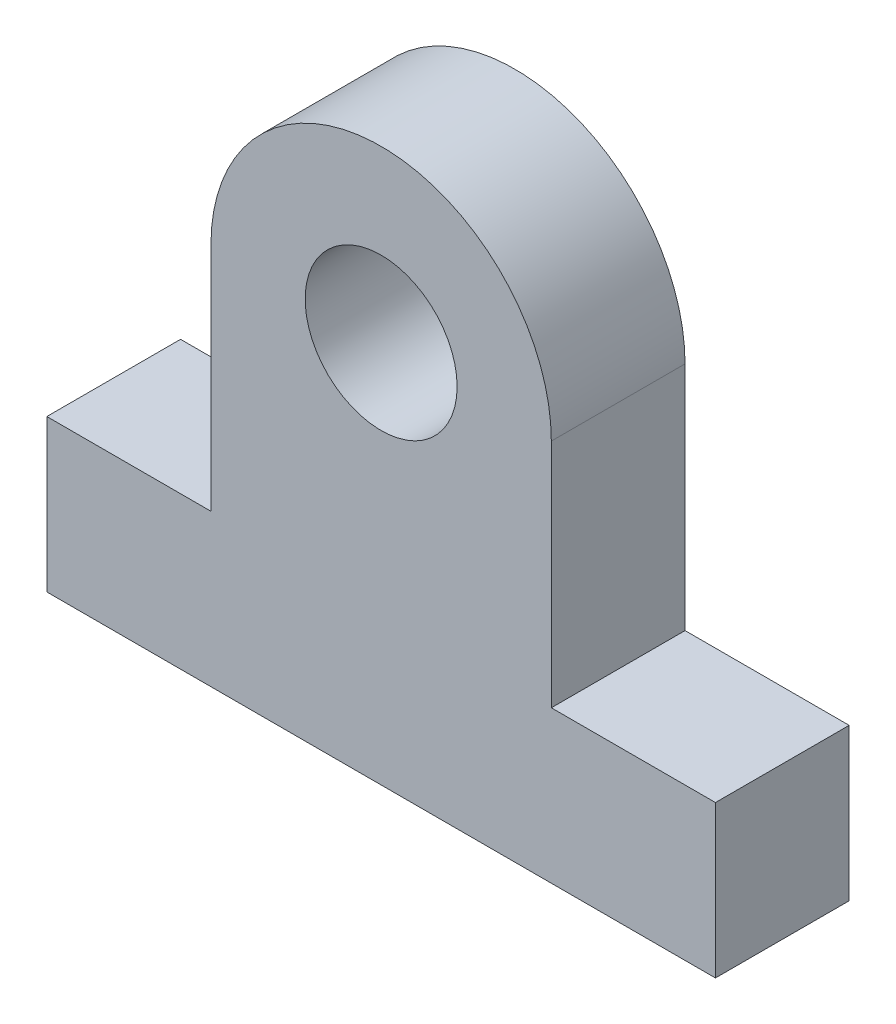
ISO-10303-21;
HEADER;
FILE_DESCRIPTION(('STEP AP214'),'2;1');
FILE_NAME('part.step','',(''),(''),'','','');
FILE_SCHEMA(('AUTOMOTIVE_DESIGN { 1 0 10303 214 1 1 1 1 }'));
ENDSEC;
DATA;
#1=APPLICATION_CONTEXT('core data for automotive mechanical design processes');
#2=APPLICATION_PROTOCOL_DEFINITION('international standard','automotive_design',2000,#1);
#3=PRODUCT_CONTEXT('',#1,'mechanical');
#4=PRODUCT('Part','Part','',(#3));
#5=PRODUCT_RELATED_PRODUCT_CATEGORY('part','',(#4));
#6=PRODUCT_DEFINITION_FORMATION('','',#4);
#7=PRODUCT_DEFINITION_CONTEXT('part definition',#1,'design');
#8=PRODUCT_DEFINITION('design','',#6,#7);
#9=PRODUCT_DEFINITION_SHAPE('','',#8);
#10=(LENGTH_UNIT() NAMED_UNIT(*) SI_UNIT(.MILLI.,.METRE.));
#11=(NAMED_UNIT(*) PLANE_ANGLE_UNIT() SI_UNIT($,.RADIAN.));
#12=(NAMED_UNIT(*) SI_UNIT($,.STERADIAN.) SOLID_ANGLE_UNIT());
#13=UNCERTAINTY_MEASURE_WITH_UNIT(LENGTH_MEASURE(1.E-05),#10,'distance_accuracy_value','');
#14=(GEOMETRIC_REPRESENTATION_CONTEXT(3) GLOBAL_UNCERTAINTY_ASSIGNED_CONTEXT((#13)) GLOBAL_UNIT_ASSIGNED_CONTEXT((#10,
#11,#12)) REPRESENTATION_CONTEXT('',''));
#15=CARTESIAN_POINT('',(0.,0.,0.));
#16=DIRECTION('',(0.,0.,1.));
#17=DIRECTION('',(1.,0.,0.));
#18=AXIS2_PLACEMENT_3D('',#15,#16,#17);
#19=CARTESIAN_POINT('',(0.,63.,11.));
#20=DIRECTION('',(0.,0.,-1.));
#21=DIRECTION('',(-1.,0.,0.));
#22=AXIS2_PLACEMENT_3D('',#19,#20,#21);
#23=PLANE('',#22);
#24=DIRECTION('',(0.,-1.,0.));
#25=VECTOR('',#24,1.);
#26=CARTESIAN_POINT('',(-55.,0.,11.));
#27=LINE('',#26,#25);
#28=CARTESIAN_POINT('',(-55.,25.,11.));
#29=VERTEX_POINT('',#28);
#30=CARTESIAN_POINT('',(-55.,0.,11.));
#31=VERTEX_POINT('',#30);
#32=EDGE_CURVE('E144',#29,#31,#27,.T.);
#33=ORIENTED_EDGE('',*,*,#32,.T.);
#34=DIRECTION('',(1.,0.,0.));
#35=VECTOR('',#34,1.);
#36=CARTESIAN_POINT('',(-55.,0.,11.));
#37=LINE('',#36,#35);
#38=CARTESIAN_POINT('',(55.,0.,11.));
#39=VERTEX_POINT('',#38);
#40=EDGE_CURVE('E92',#31,#39,#37,.T.);
#41=ORIENTED_EDGE('',*,*,#40,.T.);
#42=DIRECTION('',(0.,1.,0.));
#43=VECTOR('',#42,1.);
#44=CARTESIAN_POINT('',(55.,0.,11.));
#45=LINE('',#44,#43);
#46=CARTESIAN_POINT('',(55.,25.,11.));
#47=VERTEX_POINT('',#46);
#48=EDGE_CURVE('E159',#39,#47,#45,.T.);
#49=ORIENTED_EDGE('',*,*,#48,.T.);
#50=DIRECTION('',(-1.,0.,0.));
#51=VECTOR('',#50,1.);
#52=CARTESIAN_POINT('',(28.,25.,11.));
#53=LINE('',#52,#51);
#54=CARTESIAN_POINT('',(28.,25.,11.));
#55=VERTEX_POINT('',#54);
#56=EDGE_CURVE('E172',#47,#55,#53,.T.);
#57=ORIENTED_EDGE('',*,*,#56,.T.);
#58=DIRECTION('',(0.,1.,0.));
#59=VECTOR('',#58,1.);
#60=CARTESIAN_POINT('',(28.,25.,11.));
#61=LINE('',#60,#59);
#62=CARTESIAN_POINT('',(28.,63.,11.));
#63=VERTEX_POINT('',#62);
#64=EDGE_CURVE('E111',#55,#63,#61,.T.);
#65=ORIENTED_EDGE('',*,*,#64,.T.);
#66=CARTESIAN_POINT('',(0.,63.,11.));
#67=DIRECTION('',(0.,0.,1.));
#68=DIRECTION('',(-1.,0.,0.));
#69=AXIS2_PLACEMENT_3D('',#66,#67,#68);
#70=CIRCLE('',#69,28.);
#71=CARTESIAN_POINT('',(-28.,63.,11.));
#72=VERTEX_POINT('',#71);
#73=EDGE_CURVE('E105',#63,#72,#70,.T.);
#74=ORIENTED_EDGE('',*,*,#73,.T.);
#75=DIRECTION('',(0.,-1.,0.));
#76=VECTOR('',#75,1.);
#77=CARTESIAN_POINT('',(-28.,25.,11.));
#78=LINE('',#77,#76);
#79=CARTESIAN_POINT('',(-28.,25.,11.));
#80=VERTEX_POINT('',#79);
#81=EDGE_CURVE('E109',#72,#80,#78,.T.);
#82=ORIENTED_EDGE('',*,*,#81,.T.);
#83=DIRECTION('',(-1.,0.,0.));
#84=VECTOR('',#83,1.);
#85=CARTESIAN_POINT('',(-55.,25.,11.));
#86=LINE('',#85,#84);
#87=EDGE_CURVE('E49',#80,#29,#86,.T.);
#88=ORIENTED_EDGE('',*,*,#87,.T.);
#89=EDGE_LOOP('',(#33,#41,#49,#57,#65,#74,#82,#88));
#90=FACE_BOUND('',#89,.T.);
#91=CARTESIAN_POINT('',(0.,63.,11.));
#92=DIRECTION('',(0.,0.,1.));
#93=DIRECTION('',(1.,0.,0.));
#94=AXIS2_PLACEMENT_3D('',#91,#92,#93);
#95=CIRCLE('',#94,12.5);
#96=CARTESIAN_POINT('',(12.5,63.,11.));
#97=VERTEX_POINT('',#96);
#98=EDGE_CURVE('E133',#97,#97,#95,.T.);
#99=ORIENTED_EDGE('',*,*,#98,.F.);
#100=EDGE_LOOP('',(#99));
#101=FACE_BOUND('',#100,.T.);
#102=ADVANCED_FACE('F32',(#90,#101),#23,.F.);
#103=CARTESIAN_POINT('',(0.,63.,-11.));
#104=DIRECTION('',(0.,0.,-1.));
#105=DIRECTION('',(-1.,0.,0.));
#106=AXIS2_PLACEMENT_3D('',#103,#104,#105);
#107=PLANE('',#106);
#108=DIRECTION('',(0.,-1.,0.));
#109=VECTOR('',#108,1.);
#110=CARTESIAN_POINT('',(-55.,0.,-11.));
#111=LINE('',#110,#109);
#112=CARTESIAN_POINT('',(-55.,25.,-11.));
#113=VERTEX_POINT('',#112);
#114=CARTESIAN_POINT('',(-55.,0.,-11.));
#115=VERTEX_POINT('',#114);
#116=EDGE_CURVE('E129',#113,#115,#111,.T.);
#117=ORIENTED_EDGE('',*,*,#116,.F.);
#118=DIRECTION('',(-1.,0.,0.));
#119=VECTOR('',#118,1.);
#120=CARTESIAN_POINT('',(-55.,25.,-11.));
#121=LINE('',#120,#119);
#122=CARTESIAN_POINT('',(-28.,25.,-11.));
#123=VERTEX_POINT('',#122);
#124=EDGE_CURVE('E84',#123,#113,#121,.T.);
#125=ORIENTED_EDGE('',*,*,#124,.F.);
#126=DIRECTION('',(0.,-1.,0.));
#127=VECTOR('',#126,1.);
#128=CARTESIAN_POINT('',(-28.,25.,-11.));
#129=LINE('',#128,#127);
#130=CARTESIAN_POINT('',(-28.,63.,-11.));
#131=VERTEX_POINT('',#130);
#132=EDGE_CURVE('E78',#131,#123,#129,.T.);
#133=ORIENTED_EDGE('',*,*,#132,.F.);
#134=CARTESIAN_POINT('',(0.,63.,-11.));
#135=DIRECTION('',(0.,0.,1.));
#136=DIRECTION('',(-1.,0.,0.));
#137=AXIS2_PLACEMENT_3D('',#134,#135,#136);
#138=CIRCLE('',#137,28.);
#139=CARTESIAN_POINT('',(28.,63.,-11.));
#140=VERTEX_POINT('',#139);
#141=EDGE_CURVE('E119',#140,#131,#138,.T.);
#142=ORIENTED_EDGE('',*,*,#141,.F.);
#143=DIRECTION('',(0.,1.,0.));
#144=VECTOR('',#143,1.);
#145=CARTESIAN_POINT('',(28.,25.,-11.));
#146=LINE('',#145,#144);
#147=CARTESIAN_POINT('',(28.,25.,-11.));
#148=VERTEX_POINT('',#147);
#149=EDGE_CURVE('E139',#148,#140,#146,.T.);
#150=ORIENTED_EDGE('',*,*,#149,.F.);
#151=DIRECTION('',(-1.,0.,0.));
#152=VECTOR('',#151,1.);
#153=CARTESIAN_POINT('',(28.,25.,-11.));
#154=LINE('',#153,#152);
#155=CARTESIAN_POINT('',(55.,25.,-11.));
#156=VERTEX_POINT('',#155);
#157=EDGE_CURVE('E137',#156,#148,#154,.T.);
#158=ORIENTED_EDGE('',*,*,#157,.F.);
#159=DIRECTION('',(0.,1.,0.));
#160=VECTOR('',#159,1.);
#161=CARTESIAN_POINT('',(55.,0.,-11.));
#162=LINE('',#161,#160);
#163=CARTESIAN_POINT('',(55.,0.,-11.));
#164=VERTEX_POINT('',#163);
#165=EDGE_CURVE('E135',#164,#156,#162,.T.);
#166=ORIENTED_EDGE('',*,*,#165,.F.);
#167=DIRECTION('',(1.,0.,0.));
#168=VECTOR('',#167,1.);
#169=CARTESIAN_POINT('',(-55.,0.,-11.));
#170=LINE('',#169,#168);
#171=EDGE_CURVE('E132',#115,#164,#170,.T.);
#172=ORIENTED_EDGE('',*,*,#171,.F.);
#173=EDGE_LOOP('',(#117,#125,#133,#142,#150,#158,#166,#172));
#174=FACE_BOUND('',#173,.T.);
#175=CARTESIAN_POINT('',(0.,63.,-11.));
#176=DIRECTION('',(0.,0.,1.));
#177=DIRECTION('',(1.,0.,0.));
#178=AXIS2_PLACEMENT_3D('',#175,#176,#177);
#179=CIRCLE('',#178,12.5);
#180=CARTESIAN_POINT('',(12.5,63.,-11.));
#181=VERTEX_POINT('',#180);
#182=EDGE_CURVE('E178',#181,#181,#179,.T.);
#183=ORIENTED_EDGE('',*,*,#182,.T.);
#184=EDGE_LOOP('',(#183));
#185=FACE_BOUND('',#184,.T.);
#186=ADVANCED_FACE('F163',(#174,#185),#107,.T.);
#187=CARTESIAN_POINT('',(-55.,0.,11.));
#188=DIRECTION('',(1.,0.,0.));
#189=DIRECTION('',(0.,0.,-1.));
#190=AXIS2_PLACEMENT_3D('',#187,#188,#189);
#191=PLANE('',#190);
#192=ORIENTED_EDGE('',*,*,#116,.T.);
#193=DIRECTION('',(0.,0.,-1.));
#194=VECTOR('',#193,1.);
#195=CARTESIAN_POINT('',(-55.,0.,11.));
#196=LINE('',#195,#194);
#197=EDGE_CURVE('E11',#31,#115,#196,.T.);
#198=ORIENTED_EDGE('',*,*,#197,.F.);
#199=ORIENTED_EDGE('',*,*,#32,.F.);
#200=DIRECTION('',(0.,0.,-1.));
#201=VECTOR('',#200,1.);
#202=CARTESIAN_POINT('',(-55.,25.,11.));
#203=LINE('',#202,#201);
#204=EDGE_CURVE('E125',#29,#113,#203,.T.);
#205=ORIENTED_EDGE('',*,*,#204,.T.);
#206=EDGE_LOOP('',(#192,#198,#199,#205));
#207=FACE_BOUND('',#206,.T.);
#208=ADVANCED_FACE('F34',(#207),#191,.F.);
#209=CARTESIAN_POINT('',(-55.,0.,11.));
#210=DIRECTION('',(0.,1.,0.));
#211=DIRECTION('',(0.,0.,1.));
#212=AXIS2_PLACEMENT_3D('',#209,#210,#211);
#213=PLANE('',#212);
#214=ORIENTED_EDGE('',*,*,#171,.T.);
#215=DIRECTION('',(0.,0.,-1.));
#216=VECTOR('',#215,1.);
#217=CARTESIAN_POINT('',(55.,0.,11.));
#218=LINE('',#217,#216);
#219=EDGE_CURVE('E41',#39,#164,#218,.T.);
#220=ORIENTED_EDGE('',*,*,#219,.F.);
#221=ORIENTED_EDGE('',*,*,#40,.F.);
#222=ORIENTED_EDGE('',*,*,#197,.T.);
#223=EDGE_LOOP('',(#214,#220,#221,#222));
#224=FACE_BOUND('',#223,.T.);
#225=ADVANCED_FACE('F206',(#224),#213,.F.);
#226=CARTESIAN_POINT('',(55.,0.,11.));
#227=DIRECTION('',(-1.,0.,0.));
#228=DIRECTION('',(0.,-1.,0.));
#229=AXIS2_PLACEMENT_3D('',#226,#227,#228);
#230=PLANE('',#229);
#231=ORIENTED_EDGE('',*,*,#165,.T.);
#232=DIRECTION('',(0.,0.,-1.));
#233=VECTOR('',#232,1.);
#234=CARTESIAN_POINT('',(55.,25.,11.));
#235=LINE('',#234,#233);
#236=EDGE_CURVE('E151',#47,#156,#235,.T.);
#237=ORIENTED_EDGE('',*,*,#236,.F.);
#238=ORIENTED_EDGE('',*,*,#48,.F.);
#239=ORIENTED_EDGE('',*,*,#219,.T.);
#240=EDGE_LOOP('',(#231,#237,#238,#239));
#241=FACE_BOUND('',#240,.T.);
#242=ADVANCED_FACE('F157',(#241),#230,.F.);
#243=CARTESIAN_POINT('',(28.,25.,11.));
#244=DIRECTION('',(0.,-1.,0.));
#245=DIRECTION('',(1.,0.,0.));
#246=AXIS2_PLACEMENT_3D('',#243,#244,#245);
#247=PLANE('',#246);
#248=ORIENTED_EDGE('',*,*,#157,.T.);
#249=DIRECTION('',(0.,0.,-1.));
#250=VECTOR('',#249,1.);
#251=CARTESIAN_POINT('',(28.,25.,11.));
#252=LINE('',#251,#250);
#253=EDGE_CURVE('E148',#55,#148,#252,.T.);
#254=ORIENTED_EDGE('',*,*,#253,.F.);
#255=ORIENTED_EDGE('',*,*,#56,.F.);
#256=ORIENTED_EDGE('',*,*,#236,.T.);
#257=EDGE_LOOP('',(#248,#254,#255,#256));
#258=FACE_BOUND('',#257,.T.);
#259=ADVANCED_FACE('F168',(#258),#247,.F.);
#260=CARTESIAN_POINT('',(28.,25.,11.));
#261=DIRECTION('',(-1.,0.,0.));
#262=DIRECTION('',(0.,-1.,0.));
#263=AXIS2_PLACEMENT_3D('',#260,#261,#262);
#264=PLANE('',#263);
#265=ORIENTED_EDGE('',*,*,#149,.T.);
#266=DIRECTION('',(0.,0.,-1.));
#267=VECTOR('',#266,1.);
#268=CARTESIAN_POINT('',(28.,63.,11.));
#269=LINE('',#268,#267);
#270=EDGE_CURVE('E120',#63,#140,#269,.T.);
#271=ORIENTED_EDGE('',*,*,#270,.F.);
#272=ORIENTED_EDGE('',*,*,#64,.F.);
#273=ORIENTED_EDGE('',*,*,#253,.T.);
#274=EDGE_LOOP('',(#265,#271,#272,#273));
#275=FACE_BOUND('',#274,.T.);
#276=ADVANCED_FACE('F171',(#275),#264,.F.);
#277=CARTESIAN_POINT('',(0.,63.,11.));
#278=DIRECTION('',(0.,0.,-1.));
#279=DIRECTION('',(-1.,0.,0.));
#280=AXIS2_PLACEMENT_3D('',#277,#278,#279);
#281=CYLINDRICAL_SURFACE('',#280,28.);
#282=ORIENTED_EDGE('',*,*,#141,.T.);
#283=DIRECTION('',(0.,0.,-1.));
#284=VECTOR('',#283,1.);
#285=CARTESIAN_POINT('',(-28.,63.,11.));
#286=LINE('',#285,#284);
#287=EDGE_CURVE('E116',#72,#131,#286,.T.);
#288=ORIENTED_EDGE('',*,*,#287,.F.);
#289=ORIENTED_EDGE('',*,*,#73,.F.);
#290=ORIENTED_EDGE('',*,*,#270,.T.);
#291=EDGE_LOOP('',(#282,#288,#289,#290));
#292=FACE_BOUND('',#291,.T.);
#293=ADVANCED_FACE('F117',(#292),#281,.T.);
#294=CARTESIAN_POINT('',(-28.,25.,11.));
#295=DIRECTION('',(1.,0.,0.));
#296=DIRECTION('',(0.,1.,0.));
#297=AXIS2_PLACEMENT_3D('',#294,#295,#296);
#298=PLANE('',#297);
#299=ORIENTED_EDGE('',*,*,#132,.T.);
#300=DIRECTION('',(0.,0.,-1.));
#301=VECTOR('',#300,1.);
#302=CARTESIAN_POINT('',(-28.,25.,11.));
#303=LINE('',#302,#301);
#304=EDGE_CURVE('E121',#80,#123,#303,.T.);
#305=ORIENTED_EDGE('',*,*,#304,.F.);
#306=ORIENTED_EDGE('',*,*,#81,.F.);
#307=ORIENTED_EDGE('',*,*,#287,.T.);
#308=EDGE_LOOP('',(#299,#305,#306,#307));
#309=FACE_BOUND('',#308,.T.);
#310=ADVANCED_FACE('F123',(#309),#298,.F.);
#311=CARTESIAN_POINT('',(-55.,25.,11.));
#312=DIRECTION('',(0.,-1.,0.));
#313=DIRECTION('',(1.,0.,0.));
#314=AXIS2_PLACEMENT_3D('',#311,#312,#313);
#315=PLANE('',#314);
#316=ORIENTED_EDGE('',*,*,#124,.T.);
#317=ORIENTED_EDGE('',*,*,#204,.F.);
#318=ORIENTED_EDGE('',*,*,#87,.F.);
#319=ORIENTED_EDGE('',*,*,#304,.T.);
#320=EDGE_LOOP('',(#316,#317,#318,#319));
#321=FACE_BOUND('',#320,.T.);
#322=ADVANCED_FACE('F194',(#321),#315,.F.);
#323=CARTESIAN_POINT('',(0.,63.,11.));
#324=DIRECTION('',(0.,0.,-1.));
#325=DIRECTION('',(-1.,0.,0.));
#326=AXIS2_PLACEMENT_3D('',#323,#324,#325);
#327=CYLINDRICAL_SURFACE('',#326,12.5);
#328=ORIENTED_EDGE('',*,*,#98,.T.);
#329=EDGE_LOOP('',(#328));
#330=FACE_BOUND('',#329,.T.);
#331=ORIENTED_EDGE('',*,*,#182,.F.);
#332=EDGE_LOOP('',(#331));
#333=FACE_BOUND('',#332,.T.);
#334=ADVANCED_FACE('F184',(#330,#333),#327,.F.);
#335=CLOSED_SHELL('',(#102,#186,#208,#225,#242,#259,#276,#293,#310,#322,#334));
#336=MANIFOLD_SOLID_BREP('B2',#335);
#337=ADVANCED_BREP_SHAPE_REPRESENTATION('',(#18,#336),#14);
#338=SHAPE_DEFINITION_REPRESENTATION(#9,#337);
ENDSEC;
END-ISO-10303-21;
